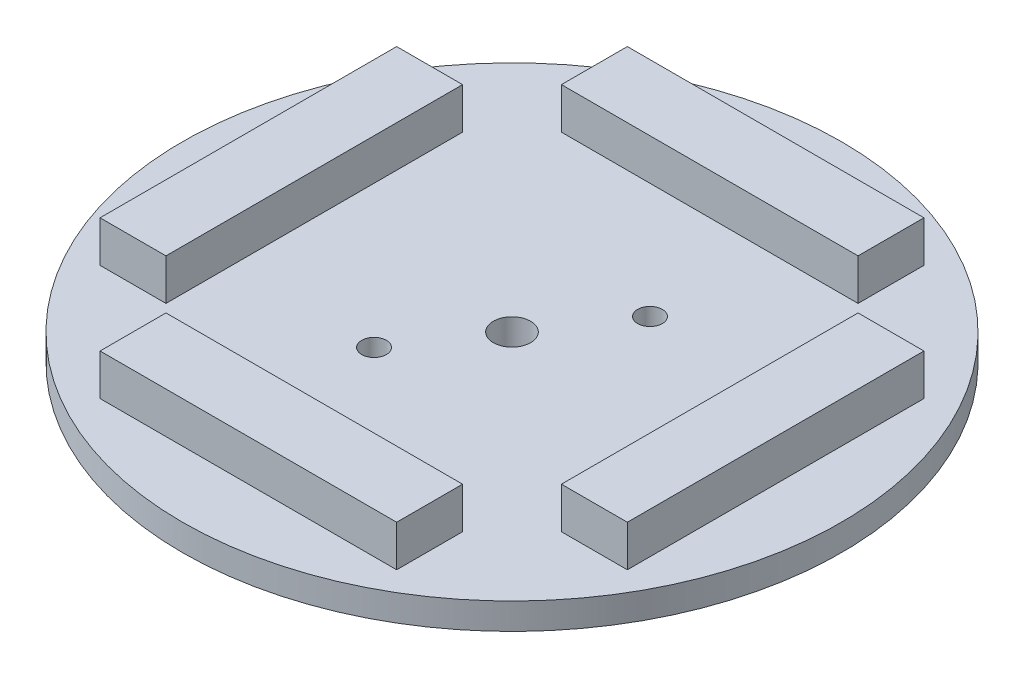
ISO-10303-21;
HEADER;
FILE_DESCRIPTION(('STEP AP214'),'2;1');
FILE_NAME('part.step','',(''),(''),'','','');
FILE_SCHEMA(('AUTOMOTIVE_DESIGN { 1 0 10303 214 1 1 1 1 }'));
ENDSEC;
DATA;
#1=APPLICATION_CONTEXT('core data for automotive mechanical design processes');
#2=APPLICATION_PROTOCOL_DEFINITION('international standard','automotive_design',2000,#1);
#3=PRODUCT_CONTEXT('',#1,'mechanical');
#4=PRODUCT('Part','Part','',(#3));
#5=PRODUCT_RELATED_PRODUCT_CATEGORY('part','',(#4));
#6=PRODUCT_DEFINITION_FORMATION('','',#4);
#7=PRODUCT_DEFINITION_CONTEXT('part definition',#1,'design');
#8=PRODUCT_DEFINITION('design','',#6,#7);
#9=PRODUCT_DEFINITION_SHAPE('','',#8);
#10=(LENGTH_UNIT() NAMED_UNIT(*) SI_UNIT(.MILLI.,.METRE.));
#11=(NAMED_UNIT(*) PLANE_ANGLE_UNIT() SI_UNIT($,.RADIAN.));
#12=(NAMED_UNIT(*) SI_UNIT($,.STERADIAN.) SOLID_ANGLE_UNIT());
#13=UNCERTAINTY_MEASURE_WITH_UNIT(LENGTH_MEASURE(1.E-05),#10,'distance_accuracy_value','');
#14=(GEOMETRIC_REPRESENTATION_CONTEXT(3) GLOBAL_UNCERTAINTY_ASSIGNED_CONTEXT((#13)) GLOBAL_UNIT_ASSIGNED_CONTEXT((#10,
#11,#12)) REPRESENTATION_CONTEXT('',''));
#15=CARTESIAN_POINT('',(0.,0.,0.));
#16=DIRECTION('',(0.,0.,1.));
#17=DIRECTION('',(1.,0.,0.));
#18=AXIS2_PLACEMENT_3D('',#15,#16,#17);
#19=CARTESIAN_POINT('',(0.,1.6,0.));
#20=DIRECTION('',(0.,1.,0.));
#21=DIRECTION('',(0.,0.,1.));
#22=AXIS2_PLACEMENT_3D('',#19,#20,#21);
#23=PLANE('',#22);
#24=CARTESIAN_POINT('',(0.,1.6,0.));
#25=DIRECTION('',(0.,1.,0.));
#26=DIRECTION('',(0.,0.,1.));
#27=AXIS2_PLACEMENT_3D('',#24,#25,#26);
#28=CIRCLE('',#27,1.1303);
#29=CARTESIAN_POINT('',(0.,1.6,1.1303));
#30=VERTEX_POINT('',#29);
#31=EDGE_CURVE('E298',#30,#30,#28,.T.);
#32=ORIENTED_EDGE('',*,*,#31,.F.);
#33=EDGE_LOOP('',(#32));
#34=FACE_BOUND('',#33,.T.);
#35=CARTESIAN_POINT('',(0.,1.6,0.));
#36=DIRECTION('',(0.,1.,0.));
#37=DIRECTION('',(0.,0.,1.));
#38=AXIS2_PLACEMENT_3D('',#35,#36,#37);
#39=CIRCLE('',#38,20.);
#40=CARTESIAN_POINT('',(0.,1.6,20.));
#41=VERTEX_POINT('',#40);
#42=EDGE_CURVE('E12',#41,#41,#39,.T.);
#43=ORIENTED_EDGE('',*,*,#42,.T.);
#44=EDGE_LOOP('',(#43));
#45=FACE_BOUND('',#44,.T.);
#46=CARTESIAN_POINT('',(-3.37254258421209,1.6,5.));
#47=DIRECTION('',(0.,1.,0.));
#48=DIRECTION('',(0.,0.,1.));
#49=AXIS2_PLACEMENT_3D('',#46,#47,#48);
#50=CIRCLE('',#49,0.75);
#51=CARTESIAN_POINT('',(-3.37254258421209,1.6,5.75));
#52=VERTEX_POINT('',#51);
#53=EDGE_CURVE('E304',#52,#52,#50,.T.);
#54=ORIENTED_EDGE('',*,*,#53,.F.);
#55=EDGE_LOOP('',(#54));
#56=FACE_BOUND('',#55,.T.);
#57=CARTESIAN_POINT('',(3.37254258421208,1.6,-5.));
#58=DIRECTION('',(0.,1.,0.));
#59=DIRECTION('',(0.,0.,1.));
#60=AXIS2_PLACEMENT_3D('',#57,#58,#59);
#61=CIRCLE('',#60,0.75);
#62=CARTESIAN_POINT('',(3.37254258421208,1.6,-4.25));
#63=VERTEX_POINT('',#62);
#64=EDGE_CURVE('E292',#63,#63,#61,.T.);
#65=ORIENTED_EDGE('',*,*,#64,.F.);
#66=EDGE_LOOP('',(#65));
#67=FACE_BOUND('',#66,.T.);
#68=DIRECTION('',(1.,0.,0.));
#69=VECTOR('',#68,1.);
#70=CARTESIAN_POINT('',(-9.,1.6,-12.));
#71=LINE('',#70,#69);
#72=CARTESIAN_POINT('',(-9.,1.6,-12.));
#73=VERTEX_POINT('',#72);
#74=CARTESIAN_POINT('',(9.,1.6,-12.));
#75=VERTEX_POINT('',#74);
#76=EDGE_CURVE('E274',#73,#75,#71,.T.);
#77=ORIENTED_EDGE('',*,*,#76,.F.);
#78=DIRECTION('',(0.,0.,1.));
#79=VECTOR('',#78,1.);
#80=CARTESIAN_POINT('',(-9.,1.6,-16.));
#81=LINE('',#80,#79);
#82=CARTESIAN_POINT('',(-9.,1.6,-16.));
#83=VERTEX_POINT('',#82);
#84=EDGE_CURVE('E258',#83,#73,#81,.T.);
#85=ORIENTED_EDGE('',*,*,#84,.F.);
#86=DIRECTION('',(1.,0.,0.));
#87=VECTOR('',#86,1.);
#88=CARTESIAN_POINT('',(-9.,1.6,-16.));
#89=LINE('',#88,#87);
#90=CARTESIAN_POINT('',(9.,1.6,-16.));
#91=VERTEX_POINT('',#90);
#92=EDGE_CURVE('E263',#83,#91,#89,.T.);
#93=ORIENTED_EDGE('',*,*,#92,.T.);
#94=DIRECTION('',(0.,0.,1.));
#95=VECTOR('',#94,1.);
#96=CARTESIAN_POINT('',(9.,1.6,-16.));
#97=LINE('',#96,#95);
#98=EDGE_CURVE('E277',#91,#75,#97,.T.);
#99=ORIENTED_EDGE('',*,*,#98,.T.);
#100=EDGE_LOOP('',(#77,#85,#93,#99));
#101=FACE_BOUND('',#100,.T.);
#102=DIRECTION('',(0.,0.,-1.));
#103=VECTOR('',#102,1.);
#104=CARTESIAN_POINT('',(-12.,1.6,9.00000000000004));
#105=LINE('',#104,#103);
#106=CARTESIAN_POINT('',(-12.,1.6,9.00000000000004));
#107=VERTEX_POINT('',#106);
#108=CARTESIAN_POINT('',(-12.,1.6,-8.99999999999996));
#109=VERTEX_POINT('',#108);
#110=EDGE_CURVE('E241',#107,#109,#105,.T.);
#111=ORIENTED_EDGE('',*,*,#110,.F.);
#112=DIRECTION('',(1.,0.,0.));
#113=VECTOR('',#112,1.);
#114=CARTESIAN_POINT('',(-16.,1.6,9.00000000000006));
#115=LINE('',#114,#113);
#116=CARTESIAN_POINT('',(-16.,1.6,9.00000000000006));
#117=VERTEX_POINT('',#116);
#118=EDGE_CURVE('E225',#117,#107,#115,.T.);
#119=ORIENTED_EDGE('',*,*,#118,.F.);
#120=DIRECTION('',(0.,0.,-1.));
#121=VECTOR('',#120,1.);
#122=CARTESIAN_POINT('',(-16.,1.6,9.00000000000006));
#123=LINE('',#122,#121);
#124=CARTESIAN_POINT('',(-16.,1.6,-8.99999999999994));
#125=VERTEX_POINT('',#124);
#126=EDGE_CURVE('E230',#117,#125,#123,.T.);
#127=ORIENTED_EDGE('',*,*,#126,.T.);
#128=DIRECTION('',(1.,0.,0.));
#129=VECTOR('',#128,1.);
#130=CARTESIAN_POINT('',(-16.,1.6,-8.99999999999994));
#131=LINE('',#130,#129);
#132=EDGE_CURVE('E244',#125,#109,#131,.T.);
#133=ORIENTED_EDGE('',*,*,#132,.T.);
#134=EDGE_LOOP('',(#111,#119,#127,#133));
#135=FACE_BOUND('',#134,.T.);
#136=DIRECTION('',(-1.,0.,0.));
#137=VECTOR('',#136,1.);
#138=CARTESIAN_POINT('',(9.,1.6,12.));
#139=LINE('',#138,#137);
#140=CARTESIAN_POINT('',(9.,1.6,12.));
#141=VERTEX_POINT('',#140);
#142=CARTESIAN_POINT('',(-9.,1.6,12.));
#143=VERTEX_POINT('',#142);
#144=EDGE_CURVE('E190',#141,#143,#139,.T.);
#145=ORIENTED_EDGE('',*,*,#144,.F.);
#146=DIRECTION('',(0.,0.,-1.));
#147=VECTOR('',#146,1.);
#148=CARTESIAN_POINT('',(9.,1.6,16.));
#149=LINE('',#148,#147);
#150=CARTESIAN_POINT('',(9.,1.6,16.));
#151=VERTEX_POINT('',#150);
#152=EDGE_CURVE('E187',#151,#141,#149,.T.);
#153=ORIENTED_EDGE('',*,*,#152,.F.);
#154=DIRECTION('',(-1.,0.,0.));
#155=VECTOR('',#154,1.);
#156=CARTESIAN_POINT('',(9.,1.6,16.));
#157=LINE('',#156,#155);
#158=CARTESIAN_POINT('',(-9.,1.6,16.));
#159=VERTEX_POINT('',#158);
#160=EDGE_CURVE('E200',#151,#159,#157,.T.);
#161=ORIENTED_EDGE('',*,*,#160,.T.);
#162=DIRECTION('',(0.,0.,-1.));
#163=VECTOR('',#162,1.);
#164=CARTESIAN_POINT('',(-9.,1.6,16.));
#165=LINE('',#164,#163);
#166=EDGE_CURVE('E211',#159,#143,#165,.T.);
#167=ORIENTED_EDGE('',*,*,#166,.T.);
#168=EDGE_LOOP('',(#145,#153,#161,#167));
#169=FACE_BOUND('',#168,.T.);
#170=DIRECTION('',(0.,0.,1.));
#171=VECTOR('',#170,1.);
#172=CARTESIAN_POINT('',(11.9999999999999,1.6,-9.00000000000012));
#173=LINE('',#172,#171);
#174=CARTESIAN_POINT('',(11.9999999999999,1.6,-9.00000000000012));
#175=VERTEX_POINT('',#174);
#176=CARTESIAN_POINT('',(12.0000000000001,1.6,8.99999999999988));
#177=VERTEX_POINT('',#176);
#178=EDGE_CURVE('E67',#175,#177,#173,.T.);
#179=ORIENTED_EDGE('',*,*,#178,.F.);
#180=DIRECTION('',(-1.,0.,0.));
#181=VECTOR('',#180,1.);
#182=CARTESIAN_POINT('',(15.9999999999999,1.6,-9.00000000000017));
#183=LINE('',#182,#181);
#184=CARTESIAN_POINT('',(15.9999999999999,1.6,-9.00000000000017));
#185=VERTEX_POINT('',#184);
#186=EDGE_CURVE('E186',#185,#175,#183,.T.);
#187=ORIENTED_EDGE('',*,*,#186,.F.);
#188=DIRECTION('',(0.,0.,1.));
#189=VECTOR('',#188,1.);
#190=CARTESIAN_POINT('',(15.9999999999999,1.6,-9.00000000000017));
#191=LINE('',#190,#189);
#192=CARTESIAN_POINT('',(16.0000000000001,1.6,8.99999999999983));
#193=VERTEX_POINT('',#192);
#194=EDGE_CURVE('E183',#185,#193,#191,.T.);
#195=ORIENTED_EDGE('',*,*,#194,.T.);
#196=DIRECTION('',(-1.,0.,0.));
#197=VECTOR('',#196,1.);
#198=CARTESIAN_POINT('',(16.0000000000001,1.6,8.99999999999983));
#199=LINE('',#198,#197);
#200=EDGE_CURVE('E72',#193,#177,#199,.T.);
#201=ORIENTED_EDGE('',*,*,#200,.T.);
#202=EDGE_LOOP('',(#179,#187,#195,#201));
#203=FACE_BOUND('',#202,.T.);
#204=ADVANCED_FACE('F52',(#34,#45,#56,#67,#101,#135,#169,#203),#23,.T.);
#205=CARTESIAN_POINT('',(0.,0.,0.));
#206=DIRECTION('',(0.,1.,0.));
#207=DIRECTION('',(0.,0.,1.));
#208=AXIS2_PLACEMENT_3D('',#205,#206,#207);
#209=PLANE('',#208);
#210=CARTESIAN_POINT('',(0.,0.,0.));
#211=DIRECTION('',(0.,1.,0.));
#212=DIRECTION('',(0.,0.,1.));
#213=AXIS2_PLACEMENT_3D('',#210,#211,#212);
#214=CIRCLE('',#213,20.);
#215=CARTESIAN_POINT('',(0.,0.,20.));
#216=VERTEX_POINT('',#215);
#217=EDGE_CURVE('E56',#216,#216,#214,.T.);
#218=ORIENTED_EDGE('',*,*,#217,.F.);
#219=EDGE_LOOP('',(#218));
#220=FACE_BOUND('',#219,.T.);
#221=CARTESIAN_POINT('',(-3.37254258421209,0.,5.));
#222=DIRECTION('',(0.,1.,0.));
#223=DIRECTION('',(0.,0.,1.));
#224=AXIS2_PLACEMENT_3D('',#221,#222,#223);
#225=CIRCLE('',#224,0.75);
#226=CARTESIAN_POINT('',(-3.37254258421209,0.,5.75));
#227=VERTEX_POINT('',#226);
#228=EDGE_CURVE('E301',#227,#227,#225,.T.);
#229=ORIENTED_EDGE('',*,*,#228,.T.);
#230=EDGE_LOOP('',(#229));
#231=FACE_BOUND('',#230,.T.);
#232=CARTESIAN_POINT('',(0.,0.,0.));
#233=DIRECTION('',(0.,1.,0.));
#234=DIRECTION('',(0.,0.,1.));
#235=AXIS2_PLACEMENT_3D('',#232,#233,#234);
#236=CIRCLE('',#235,1.1303);
#237=CARTESIAN_POINT('',(0.,0.,1.1303));
#238=VERTEX_POINT('',#237);
#239=EDGE_CURVE('E295',#238,#238,#236,.T.);
#240=ORIENTED_EDGE('',*,*,#239,.T.);
#241=EDGE_LOOP('',(#240));
#242=FACE_BOUND('',#241,.T.);
#243=CARTESIAN_POINT('',(3.37254258421208,0.,-5.));
#244=DIRECTION('',(0.,1.,0.));
#245=DIRECTION('',(0.,0.,1.));
#246=AXIS2_PLACEMENT_3D('',#243,#244,#245);
#247=CIRCLE('',#246,0.75);
#248=CARTESIAN_POINT('',(3.37254258421208,0.,-4.25));
#249=VERTEX_POINT('',#248);
#250=EDGE_CURVE('E291',#249,#249,#247,.T.);
#251=ORIENTED_EDGE('',*,*,#250,.T.);
#252=EDGE_LOOP('',(#251));
#253=FACE_BOUND('',#252,.T.);
#254=ADVANCED_FACE('F310',(#220,#231,#242,#253),#209,.F.);
#255=CARTESIAN_POINT('',(0.,1.6,0.));
#256=DIRECTION('',(0.,-1.,0.));
#257=DIRECTION('',(0.,0.,-1.));
#258=AXIS2_PLACEMENT_3D('',#255,#256,#257);
#259=CYLINDRICAL_SURFACE('',#258,20.);
#260=ORIENTED_EDGE('',*,*,#42,.F.);
#261=EDGE_LOOP('',(#260));
#262=FACE_BOUND('',#261,.T.);
#263=ORIENTED_EDGE('',*,*,#217,.T.);
#264=EDGE_LOOP('',(#263));
#265=FACE_BOUND('',#264,.T.);
#266=ADVANCED_FACE('F54',(#262,#265),#259,.T.);
#267=CARTESIAN_POINT('',(-3.37254258421209,1.6,5.));
#268=DIRECTION('',(0.,-1.,0.));
#269=DIRECTION('',(0.,0.,-1.));
#270=AXIS2_PLACEMENT_3D('',#267,#268,#269);
#271=CYLINDRICAL_SURFACE('',#270,0.75);
#272=ORIENTED_EDGE('',*,*,#53,.T.);
#273=EDGE_LOOP('',(#272));
#274=FACE_BOUND('',#273,.T.);
#275=ORIENTED_EDGE('',*,*,#228,.F.);
#276=EDGE_LOOP('',(#275));
#277=FACE_BOUND('',#276,.T.);
#278=ADVANCED_FACE('F313',(#274,#277),#271,.F.);
#279=CARTESIAN_POINT('',(0.,1.6,0.));
#280=DIRECTION('',(0.,-1.,0.));
#281=DIRECTION('',(0.,0.,-1.));
#282=AXIS2_PLACEMENT_3D('',#279,#280,#281);
#283=CYLINDRICAL_SURFACE('',#282,1.1303);
#284=ORIENTED_EDGE('',*,*,#31,.T.);
#285=EDGE_LOOP('',(#284));
#286=FACE_BOUND('',#285,.T.);
#287=ORIENTED_EDGE('',*,*,#239,.F.);
#288=EDGE_LOOP('',(#287));
#289=FACE_BOUND('',#288,.T.);
#290=ADVANCED_FACE('F315',(#286,#289),#283,.F.);
#291=CARTESIAN_POINT('',(3.37254258421208,1.6,-5.));
#292=DIRECTION('',(0.,-1.,0.));
#293=DIRECTION('',(0.,0.,-1.));
#294=AXIS2_PLACEMENT_3D('',#291,#292,#293);
#295=CYLINDRICAL_SURFACE('',#294,0.75);
#296=ORIENTED_EDGE('',*,*,#64,.T.);
#297=EDGE_LOOP('',(#296));
#298=FACE_BOUND('',#297,.T.);
#299=ORIENTED_EDGE('',*,*,#250,.F.);
#300=EDGE_LOOP('',(#299));
#301=FACE_BOUND('',#300,.T.);
#302=ADVANCED_FACE('F322',(#298,#301),#295,.F.);
#303=CARTESIAN_POINT('',(-9.,4.1,-16.));
#304=DIRECTION('',(1.,0.,0.));
#305=DIRECTION('',(0.,0.,-1.));
#306=AXIS2_PLACEMENT_3D('',#303,#304,#305);
#307=PLANE('',#306);
#308=ORIENTED_EDGE('',*,*,#84,.T.);
#309=DIRECTION('',(0.,-1.,0.));
#310=VECTOR('',#309,1.);
#311=CARTESIAN_POINT('',(-9.,4.1,-12.));
#312=LINE('',#311,#310);
#313=CARTESIAN_POINT('',(-9.,4.1,-12.));
#314=VERTEX_POINT('',#313);
#315=EDGE_CURVE('E288',#314,#73,#312,.T.);
#316=ORIENTED_EDGE('',*,*,#315,.F.);
#317=DIRECTION('',(0.,0.,1.));
#318=VECTOR('',#317,1.);
#319=CARTESIAN_POINT('',(-9.,4.1,-16.));
#320=LINE('',#319,#318);
#321=CARTESIAN_POINT('',(-9.,4.1,-16.));
#322=VERTEX_POINT('',#321);
#323=EDGE_CURVE('E259',#322,#314,#320,.T.);
#324=ORIENTED_EDGE('',*,*,#323,.F.);
#325=DIRECTION('',(0.,-1.,0.));
#326=VECTOR('',#325,1.);
#327=CARTESIAN_POINT('',(-9.,4.1,-16.));
#328=LINE('',#327,#326);
#329=EDGE_CURVE('E271',#322,#83,#328,.T.);
#330=ORIENTED_EDGE('',*,*,#329,.T.);
#331=EDGE_LOOP('',(#308,#316,#324,#330));
#332=FACE_BOUND('',#331,.T.);
#333=ADVANCED_FACE('F411',(#332),#307,.F.);
#334=CARTESIAN_POINT('',(-9.,4.1,-12.));
#335=DIRECTION('',(0.,0.,-1.));
#336=DIRECTION('',(-1.,0.,0.));
#337=AXIS2_PLACEMENT_3D('',#334,#335,#336);
#338=PLANE('',#337);
#339=ORIENTED_EDGE('',*,*,#76,.T.);
#340=DIRECTION('',(0.,-1.,0.));
#341=VECTOR('',#340,1.);
#342=CARTESIAN_POINT('',(9.,4.1,-12.));
#343=LINE('',#342,#341);
#344=CARTESIAN_POINT('',(9.,4.1,-12.));
#345=VERTEX_POINT('',#344);
#346=EDGE_CURVE('E285',#345,#75,#343,.T.);
#347=ORIENTED_EDGE('',*,*,#346,.F.);
#348=DIRECTION('',(1.,0.,0.));
#349=VECTOR('',#348,1.);
#350=CARTESIAN_POINT('',(-9.,4.1,-12.));
#351=LINE('',#350,#349);
#352=EDGE_CURVE('E262',#314,#345,#351,.T.);
#353=ORIENTED_EDGE('',*,*,#352,.F.);
#354=ORIENTED_EDGE('',*,*,#315,.T.);
#355=EDGE_LOOP('',(#339,#347,#353,#354));
#356=FACE_BOUND('',#355,.T.);
#357=ADVANCED_FACE('F407',(#356),#338,.F.);
#358=CARTESIAN_POINT('',(9.,4.1,-16.));
#359=DIRECTION('',(1.,0.,0.));
#360=DIRECTION('',(0.,0.,-1.));
#361=AXIS2_PLACEMENT_3D('',#358,#359,#360);
#362=PLANE('',#361);
#363=ORIENTED_EDGE('',*,*,#98,.F.);
#364=DIRECTION('',(0.,-1.,0.));
#365=VECTOR('',#364,1.);
#366=CARTESIAN_POINT('',(9.,4.1,-16.));
#367=LINE('',#366,#365);
#368=CARTESIAN_POINT('',(9.,4.1,-16.));
#369=VERTEX_POINT('',#368);
#370=EDGE_CURVE('E282',#369,#91,#367,.T.);
#371=ORIENTED_EDGE('',*,*,#370,.F.);
#372=DIRECTION('',(0.,0.,1.));
#373=VECTOR('',#372,1.);
#374=CARTESIAN_POINT('',(9.,4.1,-16.));
#375=LINE('',#374,#373);
#376=EDGE_CURVE('E265',#369,#345,#375,.T.);
#377=ORIENTED_EDGE('',*,*,#376,.T.);
#378=ORIENTED_EDGE('',*,*,#346,.T.);
#379=EDGE_LOOP('',(#363,#371,#377,#378));
#380=FACE_BOUND('',#379,.T.);
#381=ADVANCED_FACE('F403',(#380),#362,.T.);
#382=CARTESIAN_POINT('',(-9.,4.1,-16.));
#383=DIRECTION('',(0.,0.,-1.));
#384=DIRECTION('',(-1.,0.,0.));
#385=AXIS2_PLACEMENT_3D('',#382,#383,#384);
#386=PLANE('',#385);
#387=ORIENTED_EDGE('',*,*,#92,.F.);
#388=ORIENTED_EDGE('',*,*,#329,.F.);
#389=DIRECTION('',(1.,0.,0.));
#390=VECTOR('',#389,1.);
#391=CARTESIAN_POINT('',(-9.,4.1,-16.));
#392=LINE('',#391,#390);
#393=EDGE_CURVE('E268',#322,#369,#392,.T.);
#394=ORIENTED_EDGE('',*,*,#393,.T.);
#395=ORIENTED_EDGE('',*,*,#370,.T.);
#396=EDGE_LOOP('',(#387,#388,#394,#395));
#397=FACE_BOUND('',#396,.T.);
#398=ADVANCED_FACE('F399',(#397),#386,.T.);
#399=CARTESIAN_POINT('',(0.,4.1,0.));
#400=DIRECTION('',(0.,1.,0.));
#401=DIRECTION('',(0.,0.,1.));
#402=AXIS2_PLACEMENT_3D('',#399,#400,#401);
#403=PLANE('',#402);
#404=ORIENTED_EDGE('',*,*,#323,.T.);
#405=ORIENTED_EDGE('',*,*,#352,.T.);
#406=ORIENTED_EDGE('',*,*,#376,.F.);
#407=ORIENTED_EDGE('',*,*,#393,.F.);
#408=EDGE_LOOP('',(#404,#405,#406,#407));
#409=FACE_BOUND('',#408,.T.);
#410=ADVANCED_FACE('F395',(#409),#403,.T.);
#411=CARTESIAN_POINT('',(-16.,4.1,9.00000000000006));
#412=DIRECTION('',(0.,0.,-1.));
#413=DIRECTION('',(-1.,0.,0.));
#414=AXIS2_PLACEMENT_3D('',#411,#412,#413);
#415=PLANE('',#414);
#416=ORIENTED_EDGE('',*,*,#118,.T.);
#417=DIRECTION('',(0.,-1.,0.));
#418=VECTOR('',#417,1.);
#419=CARTESIAN_POINT('',(-12.,4.1,9.00000000000004));
#420=LINE('',#419,#418);
#421=CARTESIAN_POINT('',(-12.,4.1,9.00000000000004));
#422=VERTEX_POINT('',#421);
#423=EDGE_CURVE('E255',#422,#107,#420,.T.);
#424=ORIENTED_EDGE('',*,*,#423,.F.);
#425=DIRECTION('',(1.,0.,0.));
#426=VECTOR('',#425,1.);
#427=CARTESIAN_POINT('',(-16.,4.1,9.00000000000006));
#428=LINE('',#427,#426);
#429=CARTESIAN_POINT('',(-16.,4.1,9.00000000000006));
#430=VERTEX_POINT('',#429);
#431=EDGE_CURVE('E226',#430,#422,#428,.T.);
#432=ORIENTED_EDGE('',*,*,#431,.F.);
#433=DIRECTION('',(0.,-1.,0.));
#434=VECTOR('',#433,1.);
#435=CARTESIAN_POINT('',(-16.,4.1,9.00000000000006));
#436=LINE('',#435,#434);
#437=EDGE_CURVE('E238',#430,#117,#436,.T.);
#438=ORIENTED_EDGE('',*,*,#437,.T.);
#439=EDGE_LOOP('',(#416,#424,#432,#438));
#440=FACE_BOUND('',#439,.T.);
#441=ADVANCED_FACE('F391',(#440),#415,.F.);
#442=CARTESIAN_POINT('',(-12.,4.1,9.00000000000004));
#443=DIRECTION('',(-1.,0.,0.));
#444=DIRECTION('',(0.,0.,1.));
#445=AXIS2_PLACEMENT_3D('',#442,#443,#444);
#446=PLANE('',#445);
#447=ORIENTED_EDGE('',*,*,#110,.T.);
#448=DIRECTION('',(0.,-1.,0.));
#449=VECTOR('',#448,1.);
#450=CARTESIAN_POINT('',(-12.,4.1,-8.99999999999996));
#451=LINE('',#450,#449);
#452=CARTESIAN_POINT('',(-12.,4.1,-8.99999999999996));
#453=VERTEX_POINT('',#452);
#454=EDGE_CURVE('E252',#453,#109,#451,.T.);
#455=ORIENTED_EDGE('',*,*,#454,.F.);
#456=DIRECTION('',(0.,0.,-1.));
#457=VECTOR('',#456,1.);
#458=CARTESIAN_POINT('',(-12.,4.1,9.00000000000004));
#459=LINE('',#458,#457);
#460=EDGE_CURVE('E229',#422,#453,#459,.T.);
#461=ORIENTED_EDGE('',*,*,#460,.F.);
#462=ORIENTED_EDGE('',*,*,#423,.T.);
#463=EDGE_LOOP('',(#447,#455,#461,#462));
#464=FACE_BOUND('',#463,.T.);
#465=ADVANCED_FACE('F387',(#464),#446,.F.);
#466=CARTESIAN_POINT('',(-16.,4.1,-8.99999999999994));
#467=DIRECTION('',(0.,0.,-1.));
#468=DIRECTION('',(-1.,0.,0.));
#469=AXIS2_PLACEMENT_3D('',#466,#467,#468);
#470=PLANE('',#469);
#471=ORIENTED_EDGE('',*,*,#132,.F.);
#472=DIRECTION('',(0.,-1.,0.));
#473=VECTOR('',#472,1.);
#474=CARTESIAN_POINT('',(-16.,4.1,-8.99999999999994));
#475=LINE('',#474,#473);
#476=CARTESIAN_POINT('',(-16.,4.1,-8.99999999999994));
#477=VERTEX_POINT('',#476);
#478=EDGE_CURVE('E249',#477,#125,#475,.T.);
#479=ORIENTED_EDGE('',*,*,#478,.F.);
#480=DIRECTION('',(1.,0.,0.));
#481=VECTOR('',#480,1.);
#482=CARTESIAN_POINT('',(-16.,4.1,-8.99999999999994));
#483=LINE('',#482,#481);
#484=EDGE_CURVE('E232',#477,#453,#483,.T.);
#485=ORIENTED_EDGE('',*,*,#484,.T.);
#486=ORIENTED_EDGE('',*,*,#454,.T.);
#487=EDGE_LOOP('',(#471,#479,#485,#486));
#488=FACE_BOUND('',#487,.T.);
#489=ADVANCED_FACE('F383',(#488),#470,.T.);
#490=CARTESIAN_POINT('',(-16.,4.1,9.00000000000006));
#491=DIRECTION('',(-1.,0.,0.));
#492=DIRECTION('',(0.,0.,1.));
#493=AXIS2_PLACEMENT_3D('',#490,#491,#492);
#494=PLANE('',#493);
#495=ORIENTED_EDGE('',*,*,#126,.F.);
#496=ORIENTED_EDGE('',*,*,#437,.F.);
#497=DIRECTION('',(0.,0.,-1.));
#498=VECTOR('',#497,1.);
#499=CARTESIAN_POINT('',(-16.,4.1,9.00000000000006));
#500=LINE('',#499,#498);
#501=EDGE_CURVE('E235',#430,#477,#500,.T.);
#502=ORIENTED_EDGE('',*,*,#501,.T.);
#503=ORIENTED_EDGE('',*,*,#478,.T.);
#504=EDGE_LOOP('',(#495,#496,#502,#503));
#505=FACE_BOUND('',#504,.T.);
#506=ADVANCED_FACE('F379',(#505),#494,.T.);
#507=CARTESIAN_POINT('',(0.,4.1,0.));
#508=DIRECTION('',(0.,1.,0.));
#509=DIRECTION('',(1.,0.,0.));
#510=AXIS2_PLACEMENT_3D('',#507,#508,#509);
#511=PLANE('',#510);
#512=ORIENTED_EDGE('',*,*,#431,.T.);
#513=ORIENTED_EDGE('',*,*,#460,.T.);
#514=ORIENTED_EDGE('',*,*,#484,.F.);
#515=ORIENTED_EDGE('',*,*,#501,.F.);
#516=EDGE_LOOP('',(#512,#513,#514,#515));
#517=FACE_BOUND('',#516,.T.);
#518=ADVANCED_FACE('F376',(#517),#511,.T.);
#519=CARTESIAN_POINT('',(9.,4.1,16.));
#520=DIRECTION('',(-1.,0.,0.));
#521=DIRECTION('',(0.,0.,1.));
#522=AXIS2_PLACEMENT_3D('',#519,#520,#521);
#523=PLANE('',#522);
#524=ORIENTED_EDGE('',*,*,#152,.T.);
#525=DIRECTION('',(0.,-1.,0.));
#526=VECTOR('',#525,1.);
#527=CARTESIAN_POINT('',(9.,4.1,12.));
#528=LINE('',#527,#526);
#529=CARTESIAN_POINT('',(9.,4.1,12.));
#530=VERTEX_POINT('',#529);
#531=EDGE_CURVE('E222',#530,#141,#528,.T.);
#532=ORIENTED_EDGE('',*,*,#531,.F.);
#533=DIRECTION('',(0.,0.,-1.));
#534=VECTOR('',#533,1.);
#535=CARTESIAN_POINT('',(9.,4.1,16.));
#536=LINE('',#535,#534);
#537=CARTESIAN_POINT('',(9.,4.1,16.));
#538=VERTEX_POINT('',#537);
#539=EDGE_CURVE('E196',#538,#530,#536,.T.);
#540=ORIENTED_EDGE('',*,*,#539,.F.);
#541=DIRECTION('',(0.,-1.,0.));
#542=VECTOR('',#541,1.);
#543=CARTESIAN_POINT('',(9.,4.1,16.));
#544=LINE('',#543,#542);
#545=EDGE_CURVE('E207',#538,#151,#544,.T.);
#546=ORIENTED_EDGE('',*,*,#545,.T.);
#547=EDGE_LOOP('',(#524,#532,#540,#546));
#548=FACE_BOUND('',#547,.T.);
#549=ADVANCED_FACE('F350',(#548),#523,.F.);
#550=CARTESIAN_POINT('',(9.,4.1,12.));
#551=DIRECTION('',(0.,0.,1.));
#552=DIRECTION('',(1.,0.,0.));
#553=AXIS2_PLACEMENT_3D('',#550,#551,#552);
#554=PLANE('',#553);
#555=ORIENTED_EDGE('',*,*,#144,.T.);
#556=DIRECTION('',(0.,-1.,0.));
#557=VECTOR('',#556,1.);
#558=CARTESIAN_POINT('',(-9.,4.1,12.));
#559=LINE('',#558,#557);
#560=CARTESIAN_POINT('',(-9.,4.1,12.));
#561=VERTEX_POINT('',#560);
#562=EDGE_CURVE('E219',#561,#143,#559,.T.);
#563=ORIENTED_EDGE('',*,*,#562,.F.);
#564=DIRECTION('',(-1.,0.,0.));
#565=VECTOR('',#564,1.);
#566=CARTESIAN_POINT('',(9.,4.1,12.));
#567=LINE('',#566,#565);
#568=EDGE_CURVE('E199',#530,#561,#567,.T.);
#569=ORIENTED_EDGE('',*,*,#568,.F.);
#570=ORIENTED_EDGE('',*,*,#531,.T.);
#571=EDGE_LOOP('',(#555,#563,#569,#570));
#572=FACE_BOUND('',#571,.T.);
#573=ADVANCED_FACE('F347',(#572),#554,.F.);
#574=CARTESIAN_POINT('',(-9.,4.1,16.));
#575=DIRECTION('',(-1.,0.,0.));
#576=DIRECTION('',(0.,0.,1.));
#577=AXIS2_PLACEMENT_3D('',#574,#575,#576);
#578=PLANE('',#577);
#579=ORIENTED_EDGE('',*,*,#166,.F.);
#580=DIRECTION('',(0.,-1.,0.));
#581=VECTOR('',#580,1.);
#582=CARTESIAN_POINT('',(-9.,4.1,16.));
#583=LINE('',#582,#581);
#584=CARTESIAN_POINT('',(-9.,4.1,16.));
#585=VERTEX_POINT('',#584);
#586=EDGE_CURVE('E216',#585,#159,#583,.T.);
#587=ORIENTED_EDGE('',*,*,#586,.F.);
#588=DIRECTION('',(0.,0.,-1.));
#589=VECTOR('',#588,1.);
#590=CARTESIAN_POINT('',(-9.,4.1,16.));
#591=LINE('',#590,#589);
#592=EDGE_CURVE('E202',#585,#561,#591,.T.);
#593=ORIENTED_EDGE('',*,*,#592,.T.);
#594=ORIENTED_EDGE('',*,*,#562,.T.);
#595=EDGE_LOOP('',(#579,#587,#593,#594));
#596=FACE_BOUND('',#595,.T.);
#597=ADVANCED_FACE('F357',(#596),#578,.T.);
#598=CARTESIAN_POINT('',(9.,4.1,16.));
#599=DIRECTION('',(0.,0.,1.));
#600=DIRECTION('',(1.,0.,0.));
#601=AXIS2_PLACEMENT_3D('',#598,#599,#600);
#602=PLANE('',#601);
#603=ORIENTED_EDGE('',*,*,#160,.F.);
#604=ORIENTED_EDGE('',*,*,#545,.F.);
#605=DIRECTION('',(-1.,0.,0.));
#606=VECTOR('',#605,1.);
#607=CARTESIAN_POINT('',(9.,4.1,16.));
#608=LINE('',#607,#606);
#609=EDGE_CURVE('E205',#538,#585,#608,.T.);
#610=ORIENTED_EDGE('',*,*,#609,.T.);
#611=ORIENTED_EDGE('',*,*,#586,.T.);
#612=EDGE_LOOP('',(#603,#604,#610,#611));
#613=FACE_BOUND('',#612,.T.);
#614=ADVANCED_FACE('F354',(#613),#602,.T.);
#615=CARTESIAN_POINT('',(0.,4.1,0.));
#616=DIRECTION('',(0.,1.,0.));
#617=DIRECTION('',(0.,0.,-1.));
#618=AXIS2_PLACEMENT_3D('',#615,#616,#617);
#619=PLANE('',#618);
#620=ORIENTED_EDGE('',*,*,#539,.T.);
#621=ORIENTED_EDGE('',*,*,#568,.T.);
#622=ORIENTED_EDGE('',*,*,#592,.F.);
#623=ORIENTED_EDGE('',*,*,#609,.F.);
#624=EDGE_LOOP('',(#620,#621,#622,#623));
#625=FACE_BOUND('',#624,.T.);
#626=ADVANCED_FACE('F359',(#625),#619,.T.);
#627=CARTESIAN_POINT('',(15.9999999999999,4.1,-9.00000000000017));
#628=DIRECTION('',(0.,0.,1.));
#629=DIRECTION('',(1.,0.,0.));
#630=AXIS2_PLACEMENT_3D('',#627,#628,#629);
#631=PLANE('',#630);
#632=ORIENTED_EDGE('',*,*,#186,.T.);
#633=DIRECTION('',(0.,-1.,0.));
#634=VECTOR('',#633,1.);
#635=CARTESIAN_POINT('',(11.9999999999999,4.1,-9.00000000000012));
#636=LINE('',#635,#634);
#637=CARTESIAN_POINT('',(11.9999999999999,4.1,-9.00000000000012));
#638=VERTEX_POINT('',#637);
#639=EDGE_CURVE('E167',#638,#175,#636,.T.);
#640=ORIENTED_EDGE('',*,*,#639,.F.);
#641=DIRECTION('',(-1.,0.,0.));
#642=VECTOR('',#641,1.);
#643=CARTESIAN_POINT('',(15.9999999999999,4.1,-9.00000000000017));
#644=LINE('',#643,#642);
#645=CARTESIAN_POINT('',(15.9999999999999,4.1,-9.00000000000017));
#646=VERTEX_POINT('',#645);
#647=EDGE_CURVE('E174',#646,#638,#644,.T.);
#648=ORIENTED_EDGE('',*,*,#647,.F.);
#649=DIRECTION('',(0.,-1.,0.));
#650=VECTOR('',#649,1.);
#651=CARTESIAN_POINT('',(15.9999999999999,4.1,-9.00000000000017));
#652=LINE('',#651,#650);
#653=EDGE_CURVE('E618',#646,#185,#652,.T.);
#654=ORIENTED_EDGE('',*,*,#653,.T.);
#655=EDGE_LOOP('',(#632,#640,#648,#654));
#656=FACE_BOUND('',#655,.T.);
#657=ADVANCED_FACE('F185',(#656),#631,.F.);
#658=CARTESIAN_POINT('',(11.9999999999999,4.1,-9.00000000000012));
#659=DIRECTION('',(1.,0.,0.));
#660=DIRECTION('',(0.,0.,-1.));
#661=AXIS2_PLACEMENT_3D('',#658,#659,#660);
#662=PLANE('',#661);
#663=ORIENTED_EDGE('',*,*,#178,.T.);
#664=DIRECTION('',(0.,-1.,0.));
#665=VECTOR('',#664,1.);
#666=CARTESIAN_POINT('',(12.0000000000001,4.1,8.99999999999988));
#667=LINE('',#666,#665);
#668=CARTESIAN_POINT('',(12.0000000000001,4.1,8.99999999999988));
#669=VERTEX_POINT('',#668);
#670=EDGE_CURVE('E169',#669,#177,#667,.T.);
#671=ORIENTED_EDGE('',*,*,#670,.F.);
#672=DIRECTION('',(0.,0.,1.));
#673=VECTOR('',#672,1.);
#674=CARTESIAN_POINT('',(11.9999999999999,4.1,-9.00000000000012));
#675=LINE('',#674,#673);
#676=EDGE_CURVE('E163',#638,#669,#675,.T.);
#677=ORIENTED_EDGE('',*,*,#676,.F.);
#678=ORIENTED_EDGE('',*,*,#639,.T.);
#679=EDGE_LOOP('',(#663,#671,#677,#678));
#680=FACE_BOUND('',#679,.T.);
#681=ADVANCED_FACE('F165',(#680),#662,.F.);
#682=CARTESIAN_POINT('',(16.0000000000001,4.1,8.99999999999983));
#683=DIRECTION('',(0.,0.,1.));
#684=DIRECTION('',(1.,0.,0.));
#685=AXIS2_PLACEMENT_3D('',#682,#683,#684);
#686=PLANE('',#685);
#687=ORIENTED_EDGE('',*,*,#200,.F.);
#688=DIRECTION('',(0.,-1.,0.));
#689=VECTOR('',#688,1.);
#690=CARTESIAN_POINT('',(16.0000000000001,4.1,8.99999999999983));
#691=LINE('',#690,#689);
#692=CARTESIAN_POINT('',(16.0000000000001,4.1,8.99999999999983));
#693=VERTEX_POINT('',#692);
#694=EDGE_CURVE('E192',#693,#193,#691,.T.);
#695=ORIENTED_EDGE('',*,*,#694,.F.);
#696=DIRECTION('',(-1.,0.,0.));
#697=VECTOR('',#696,1.);
#698=CARTESIAN_POINT('',(16.0000000000001,4.1,8.99999999999983));
#699=LINE('',#698,#697);
#700=EDGE_CURVE('E173',#693,#669,#699,.T.);
#701=ORIENTED_EDGE('',*,*,#700,.T.);
#702=ORIENTED_EDGE('',*,*,#670,.T.);
#703=EDGE_LOOP('',(#687,#695,#701,#702));
#704=FACE_BOUND('',#703,.T.);
#705=ADVANCED_FACE('F507',(#704),#686,.T.);
#706=CARTESIAN_POINT('',(15.9999999999999,4.1,-9.00000000000017));
#707=DIRECTION('',(1.,0.,0.));
#708=DIRECTION('',(0.,0.,-1.));
#709=AXIS2_PLACEMENT_3D('',#706,#707,#708);
#710=PLANE('',#709);
#711=ORIENTED_EDGE('',*,*,#194,.F.);
#712=ORIENTED_EDGE('',*,*,#653,.F.);
#713=DIRECTION('',(0.,0.,1.));
#714=VECTOR('',#713,1.);
#715=CARTESIAN_POINT('',(15.9999999999999,4.1,-9.00000000000017));
#716=LINE('',#715,#714);
#717=EDGE_CURVE('E180',#646,#693,#716,.T.);
#718=ORIENTED_EDGE('',*,*,#717,.T.);
#719=ORIENTED_EDGE('',*,*,#694,.T.);
#720=EDGE_LOOP('',(#711,#712,#718,#719));
#721=FACE_BOUND('',#720,.T.);
#722=ADVANCED_FACE('F498',(#721),#710,.T.);
#723=CARTESIAN_POINT('',(0.,4.1,0.));
#724=DIRECTION('',(0.,1.,0.));
#725=DIRECTION('',(-1.,0.,0.));
#726=AXIS2_PLACEMENT_3D('',#723,#724,#725);
#727=PLANE('',#726);
#728=ORIENTED_EDGE('',*,*,#647,.T.);
#729=ORIENTED_EDGE('',*,*,#676,.T.);
#730=ORIENTED_EDGE('',*,*,#700,.F.);
#731=ORIENTED_EDGE('',*,*,#717,.F.);
#732=EDGE_LOOP('',(#728,#729,#730,#731));
#733=FACE_BOUND('',#732,.T.);
#734=ADVANCED_FACE('F178',(#733),#727,.T.);
#735=CLOSED_SHELL('',(#204,#254,#266,#278,#290,#302,#333,#357,#381,#398,#410,#441,#465,#489,
#506,#518,#549,#573,#597,#614,#626,#657,#681,#705,#722,#734));
#736=MANIFOLD_SOLID_BREP('B2',#735);
#737=ADVANCED_BREP_SHAPE_REPRESENTATION('',(#18,#736),#14);
#738=SHAPE_DEFINITION_REPRESENTATION(#9,#737);
ENDSEC;
END-ISO-10303-21;
